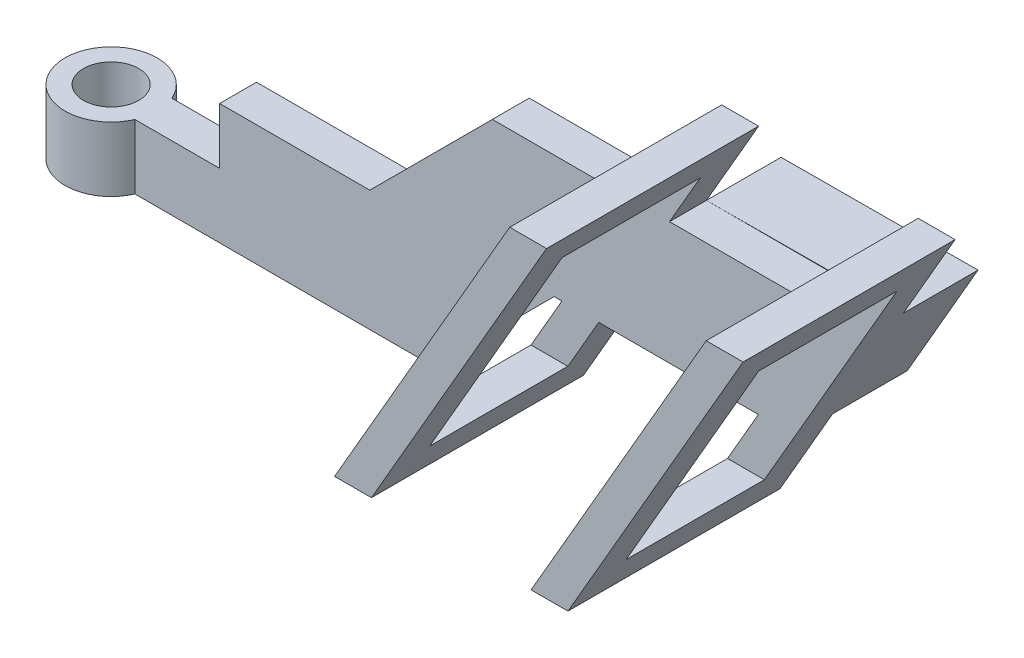
ISO-10303-21;
HEADER;
FILE_DESCRIPTION(('STEP AP214'),'2;1');
FILE_NAME('part.step','',(''),(''),'','','');
FILE_SCHEMA(('AUTOMOTIVE_DESIGN { 1 0 10303 214 1 1 1 1 }'));
ENDSEC;
DATA;
#1=APPLICATION_CONTEXT('core data for automotive mechanical design processes');
#2=APPLICATION_PROTOCOL_DEFINITION('international standard','automotive_design',2000,#1);
#3=PRODUCT_CONTEXT('',#1,'mechanical');
#4=PRODUCT('Part','Part','',(#3));
#5=PRODUCT_RELATED_PRODUCT_CATEGORY('part','',(#4));
#6=PRODUCT_DEFINITION_FORMATION('','',#4);
#7=PRODUCT_DEFINITION_CONTEXT('part definition',#1,'design');
#8=PRODUCT_DEFINITION('design','',#6,#7);
#9=PRODUCT_DEFINITION_SHAPE('','',#8);
#10=(LENGTH_UNIT() NAMED_UNIT(*) SI_UNIT(.MILLI.,.METRE.));
#11=(NAMED_UNIT(*) PLANE_ANGLE_UNIT() SI_UNIT($,.RADIAN.));
#12=(NAMED_UNIT(*) SI_UNIT($,.STERADIAN.) SOLID_ANGLE_UNIT());
#13=UNCERTAINTY_MEASURE_WITH_UNIT(LENGTH_MEASURE(1.E-05),#10,'distance_accuracy_value','');
#14=(GEOMETRIC_REPRESENTATION_CONTEXT(3) GLOBAL_UNCERTAINTY_ASSIGNED_CONTEXT((#13)) GLOBAL_UNIT_ASSIGNED_CONTEXT((#10,
#11,#12)) REPRESENTATION_CONTEXT('',''));
#15=CARTESIAN_POINT('',(0.,0.,0.));
#16=DIRECTION('',(0.,0.,1.));
#17=DIRECTION('',(1.,0.,0.));
#18=AXIS2_PLACEMENT_3D('',#15,#16,#17);
#19=CARTESIAN_POINT('',(34.5825756949558,0.,-2.));
#20=DIRECTION('',(0.,0.,-1.));
#21=DIRECTION('',(-1.,0.,0.));
#22=AXIS2_PLACEMENT_3D('',#19,#20,#21);
#23=PLANE('',#22);
#24=DIRECTION('',(1.,0.,0.));
#25=VECTOR('',#24,1.);
#26=CARTESIAN_POINT('',(50.0649607214572,13.1,-2.));
#27=LINE('',#26,#25);
#28=CARTESIAN_POINT('',(54.9050733556575,13.1,-2.00000000000001));
#29=VERTEX_POINT('',#28);
#30=CARTESIAN_POINT('',(72.2255814313463,13.1,-2.));
#31=VERTEX_POINT('',#30);
#32=EDGE_CURVE('E413',#29,#31,#27,.T.);
#33=ORIENTED_EDGE('',*,*,#32,.F.);
#34=DIRECTION('',(-0.999992305909303,-0.00392276970968819,0.));
#35=VECTOR('',#34,1.);
#36=CARTESIAN_POINT('',(54.9050733556575,13.1,-2.00000000000001));
#37=LINE('',#36,#35);
#38=CARTESIAN_POINT('',(76.2739783593554,13.1838259382421,-2.00000000000001));
#39=VERTEX_POINT('',#38);
#40=EDGE_CURVE('E276',#39,#29,#37,.T.);
#41=ORIENTED_EDGE('',*,*,#40,.F.);
#42=DIRECTION('',(0.5,0.866025403784439,0.));
#43=VECTOR('',#42,1.);
#44=CARTESIAN_POINT('',(76.2255814313462,13.1,-2.));
#45=LINE('',#44,#43);
#46=CARTESIAN_POINT('',(70.5649607214573,3.29551732809569,-2.));
#47=VERTEX_POINT('',#46);
#48=EDGE_CURVE('E418',#47,#39,#45,.T.);
#49=ORIENTED_EDGE('',*,*,#48,.F.);
#50=DIRECTION('',(1.,0.,0.));
#51=VECTOR('',#50,1.);
#52=CARTESIAN_POINT('',(66.5649607214573,3.29551732809569,-2.));
#53=LINE('',#52,#51);
#54=CARTESIAN_POINT('',(66.5649607214573,3.29551732809569,-2.));
#55=VERTEX_POINT('',#54);
#56=EDGE_CURVE('E351',#55,#47,#53,.T.);
#57=ORIENTED_EDGE('',*,*,#56,.F.);
#58=DIRECTION('',(-0.5,-0.866025403784439,0.));
#59=VECTOR('',#58,1.);
#60=CARTESIAN_POINT('',(85.5649607214573,36.2044826719044,-2.));
#61=LINE('',#60,#59);
#62=EDGE_CURVE('E353',#31,#55,#61,.T.);
#63=ORIENTED_EDGE('',*,*,#62,.F.);
#64=EDGE_LOOP('',(#33,#41,#49,#57,#63));
#65=FACE_BOUND('',#64,.T.);
#66=ADVANCED_FACE('F34',(#65),#23,.T.);
#67=DIRECTION('',(0.5,0.866025403784438,0.));
#68=VECTOR('',#67,1.);
#69=CARTESIAN_POINT('',(68.2444526457685,36.2044826719044,-2.));
#70=LINE('',#69,#68);
#71=CARTESIAN_POINT('',(62.5838319358795,26.4,-2.00000000000001));
#72=VERTEX_POINT('',#71);
#73=CARTESIAN_POINT('',(68.2444526457685,36.2044826719044,-2.));
#74=VERTEX_POINT('',#73);
#75=EDGE_CURVE('E379',#72,#74,#70,.T.);
#76=ORIENTED_EDGE('',*,*,#75,.F.);
#77=DIRECTION('',(0.5,0.866025403784438,0.));
#78=VECTOR('',#77,1.);
#79=CARTESIAN_POINT('',(54.9050733556575,13.1,-2.00000000000001));
#80=LINE('',#79,#78);
#81=EDGE_CURVE('E669',#29,#72,#80,.T.);
#82=ORIENTED_EDGE('',*,*,#81,.F.);
#83=CARTESIAN_POINT('',(49.2444526457685,3.2955173280957,-2.));
#84=VERTEX_POINT('',#83);
#85=EDGE_CURVE('E380',#84,#29,#70,.T.);
#86=ORIENTED_EDGE('',*,*,#85,.F.);
#87=DIRECTION('',(1.,0.,0.));
#88=VECTOR('',#87,1.);
#89=CARTESIAN_POINT('',(45.2444526457685,3.2955173280957,-2.));
#90=LINE('',#89,#88);
#91=CARTESIAN_POINT('',(45.2444526457685,3.2955173280957,-2.));
#92=VERTEX_POINT('',#91);
#93=EDGE_CURVE('E375',#92,#84,#90,.T.);
#94=ORIENTED_EDGE('',*,*,#93,.F.);
#95=DIRECTION('',(-0.5,-0.866025403784438,0.));
#96=VECTOR('',#95,1.);
#97=CARTESIAN_POINT('',(64.2444526457685,36.2044826719044,-2.));
#98=LINE('',#97,#96);
#99=CARTESIAN_POINT('',(50.9050733556575,13.1,-2.));
#100=VERTEX_POINT('',#99);
#101=EDGE_CURVE('E376',#100,#92,#98,.T.);
#102=ORIENTED_EDGE('',*,*,#101,.F.);
#103=CARTESIAN_POINT('',(50.0649607214572,13.1,-2.));
#104=VERTEX_POINT('',#103);
#105=EDGE_CURVE('E414',#104,#100,#27,.T.);
#106=ORIENTED_EDGE('',*,*,#105,.F.);
#107=DIRECTION('',(0.707106781186548,0.707106781186547,0.));
#108=VECTOR('',#107,1.);
#109=CARTESIAN_POINT('',(36.9649607214572,0.,-2.));
#110=LINE('',#109,#108);
#111=CARTESIAN_POINT('',(36.9649607214572,0.,-2.));
#112=VERTEX_POINT('',#111);
#113=EDGE_CURVE('E409',#112,#104,#110,.T.);
#114=ORIENTED_EDGE('',*,*,#113,.F.);
#115=DIRECTION('',(-1.,0.,0.));
#116=VECTOR('',#115,1.);
#117=CARTESIAN_POINT('',(34.5825756949558,0.,-2.));
#118=LINE('',#117,#116);
#119=CARTESIAN_POINT('',(4.58257569495584,0.,-2.));
#120=VERTEX_POINT('',#119);
#121=EDGE_CURVE('E470',#112,#120,#118,.T.);
#122=ORIENTED_EDGE('',*,*,#121,.T.);
#123=DIRECTION('',(0.,1.,0.));
#124=VECTOR('',#123,1.);
#125=CARTESIAN_POINT('',(4.58257569495584,0.,-2.));
#126=LINE('',#125,#124);
#127=CARTESIAN_POINT('',(4.58257569495584,7.,-2.));
#128=VERTEX_POINT('',#127);
#129=EDGE_CURVE('E476',#120,#128,#126,.T.);
#130=ORIENTED_EDGE('',*,*,#129,.T.);
#131=DIRECTION('',(-1.,0.,0.));
#132=VECTOR('',#131,1.);
#133=CARTESIAN_POINT('',(34.5825756949558,7.,-2.));
#134=LINE('',#133,#132);
#135=CARTESIAN_POINT('',(13.7765647923562,7.,-2.));
#136=VERTEX_POINT('',#135);
#137=EDGE_CURVE('E471',#136,#128,#134,.T.);
#138=ORIENTED_EDGE('',*,*,#137,.F.);
#139=DIRECTION('',(0.,-1.,0.));
#140=VECTOR('',#139,1.);
#141=CARTESIAN_POINT('',(13.7765647923562,0.,-2.));
#142=LINE('',#141,#140);
#143=CARTESIAN_POINT('',(13.7765647923562,13.1,-2.));
#144=VERTEX_POINT('',#143);
#145=EDGE_CURVE('E448',#144,#136,#142,.T.);
#146=ORIENTED_EDGE('',*,*,#145,.F.);
#147=DIRECTION('',(-1.,0.,0.));
#148=VECTOR('',#147,1.);
#149=CARTESIAN_POINT('',(13.7765647923562,13.1,-2.));
#150=LINE('',#149,#148);
#151=CARTESIAN_POINT('',(30.0649607214572,13.1,-2.));
#152=VERTEX_POINT('',#151);
#153=EDGE_CURVE('E451',#152,#144,#150,.T.);
#154=ORIENTED_EDGE('',*,*,#153,.F.);
#155=DIRECTION('',(-0.707106781186548,-0.707106781186547,0.));
#156=VECTOR('',#155,1.);
#157=CARTESIAN_POINT('',(43.3649607214573,26.4,-2.));
#158=LINE('',#157,#156);
#159=CARTESIAN_POINT('',(43.3649607214573,26.4,-2.));
#160=VERTEX_POINT('',#159);
#161=EDGE_CURVE('E406',#160,#152,#158,.T.);
#162=ORIENTED_EDGE('',*,*,#161,.F.);
#163=DIRECTION('',(-1.,0.,0.));
#164=VECTOR('',#163,1.);
#165=CARTESIAN_POINT('',(80.0649607214572,26.4,-2.));
#166=LINE('',#165,#164);
#167=CARTESIAN_POINT('',(58.5838319358795,26.4,-2.));
#168=VERTEX_POINT('',#167);
#169=EDGE_CURVE('E421',#168,#160,#166,.T.);
#170=ORIENTED_EDGE('',*,*,#169,.F.);
#171=CARTESIAN_POINT('',(64.2444526457685,36.2044826719044,-2.));
#172=VERTEX_POINT('',#171);
#173=EDGE_CURVE('E373',#172,#168,#98,.T.);
#174=ORIENTED_EDGE('',*,*,#173,.F.);
#175=DIRECTION('',(-1.,0.,0.));
#176=VECTOR('',#175,1.);
#177=CARTESIAN_POINT('',(64.2444526457685,36.2044826719044,-2.));
#178=LINE('',#177,#176);
#179=EDGE_CURVE('E383',#74,#172,#178,.T.);
#180=ORIENTED_EDGE('',*,*,#179,.F.);
#181=EDGE_LOOP('',(#76,#82,#86,#94,#102,#106,#114,#122,#130,#138,#146,#154,#162,#170,#174,#180));
#182=FACE_BOUND('',#181,.T.);
#183=ADVANCED_FACE('F592',(#182),#23,.T.);
#184=CARTESIAN_POINT('',(83.9527369395774,26.4838259382421,-2.00000000000001));
#185=VERTEX_POINT('',#184);
#186=CARTESIAN_POINT('',(89.5649607214573,36.2044826719044,-2.));
#187=VERTEX_POINT('',#186);
#188=EDGE_CURVE('E417',#185,#187,#45,.T.);
#189=ORIENTED_EDGE('',*,*,#188,.F.);
#190=DIRECTION('',(0.999992305909303,0.00392276970968795,0.));
#191=VECTOR('',#190,1.);
#192=CARTESIAN_POINT('',(62.5838319358795,26.4,-2.00000000000001));
#193=LINE('',#192,#191);
#194=CARTESIAN_POINT('',(79.943657056896,26.4680991201111,-2.00000000000001));
#195=VERTEX_POINT('',#194);
#196=EDGE_CURVE('E577',#195,#185,#193,.T.);
#197=ORIENTED_EDGE('',*,*,#196,.F.);
#198=CARTESIAN_POINT('',(85.5649607214573,36.2044826719044,-2.));
#199=VERTEX_POINT('',#198);
#200=EDGE_CURVE('E348',#199,#195,#61,.T.);
#201=ORIENTED_EDGE('',*,*,#200,.F.);
#202=DIRECTION('',(-1.,0.,0.));
#203=VECTOR('',#202,1.);
#204=CARTESIAN_POINT('',(85.5649607214573,36.2044826719044,-2.));
#205=LINE('',#204,#203);
#206=EDGE_CURVE('E356',#187,#199,#205,.T.);
#207=ORIENTED_EDGE('',*,*,#206,.F.);
#208=EDGE_LOOP('',(#189,#197,#201,#207));
#209=FACE_BOUND('',#208,.T.);
#210=ADVANCED_FACE('F576',(#209),#23,.T.);
#211=CARTESIAN_POINT('',(83.2555596446988,32.2044826719044,21.));
#212=DIRECTION('',(0.,1.,0.));
#213=DIRECTION('',(0.,0.,1.));
#214=AXIS2_PLACEMENT_3D('',#211,#212,#213);
#215=PLANE('',#214);
#216=DIRECTION('',(1.,0.,0.));
#217=VECTOR('',#216,1.);
#218=CARTESIAN_POINT('',(83.2555596446988,32.2044826719044,17.));
#219=LINE('',#218,#217);
#220=CARTESIAN_POINT('',(83.2555596446988,32.2044826719044,17.));
#221=VERTEX_POINT('',#220);
#222=CARTESIAN_POINT('',(87.2555596446987,32.2044826719044,17.));
#223=VERTEX_POINT('',#222);
#224=EDGE_CURVE('E289',#221,#223,#219,.T.);
#225=ORIENTED_EDGE('',*,*,#224,.F.);
#226=DIRECTION('',(0.,0.,-1.));
#227=VECTOR('',#226,1.);
#228=CARTESIAN_POINT('',(83.2555596446988,32.2044826719044,21.));
#229=LINE('',#228,#227);
#230=CARTESIAN_POINT('',(83.2555596446988,32.2044826719044,2.));
#231=VERTEX_POINT('',#230);
#232=EDGE_CURVE('E329',#221,#231,#229,.T.);
#233=ORIENTED_EDGE('',*,*,#232,.T.);
#234=DIRECTION('',(1.,0.,0.));
#235=VECTOR('',#234,1.);
#236=CARTESIAN_POINT('',(83.2555596446988,32.2044826719044,2.));
#237=LINE('',#236,#235);
#238=CARTESIAN_POINT('',(87.2555596446987,32.2044826719044,2.));
#239=VERTEX_POINT('',#238);
#240=EDGE_CURVE('E315',#231,#239,#237,.T.);
#241=ORIENTED_EDGE('',*,*,#240,.T.);
#242=DIRECTION('',(0.,0.,-1.));
#243=VECTOR('',#242,1.);
#244=CARTESIAN_POINT('',(87.2555596446988,32.2044826719044,21.));
#245=LINE('',#244,#243);
#246=EDGE_CURVE('E325',#223,#239,#245,.T.);
#247=ORIENTED_EDGE('',*,*,#246,.F.);
#248=EDGE_LOOP('',(#225,#233,#241,#247));
#249=FACE_BOUND('',#248,.T.);
#250=ADVANCED_FACE('F538',(#249),#215,.F.);
#251=CARTESIAN_POINT('',(68.8743617982158,7.2955173280957,21.));
#252=DIRECTION('',(0.,-1.,0.));
#253=DIRECTION('',(0.,0.,-1.));
#254=AXIS2_PLACEMENT_3D('',#251,#252,#253);
#255=PLANE('',#254);
#256=DIRECTION('',(-1.,0.,0.));
#257=VECTOR('',#256,1.);
#258=CARTESIAN_POINT('',(68.8743617982158,7.2955173280957,17.));
#259=LINE('',#258,#257);
#260=CARTESIAN_POINT('',(72.8743617982158,7.2955173280957,17.));
#261=VERTEX_POINT('',#260);
#262=CARTESIAN_POINT('',(68.8743617982158,7.2955173280957,17.));
#263=VERTEX_POINT('',#262);
#264=EDGE_CURVE('E11',#261,#263,#259,.T.);
#265=ORIENTED_EDGE('',*,*,#264,.F.);
#266=DIRECTION('',(0.,0.,-1.));
#267=VECTOR('',#266,1.);
#268=CARTESIAN_POINT('',(72.8743617982158,7.2955173280957,21.));
#269=LINE('',#268,#267);
#270=CARTESIAN_POINT('',(72.8743617982158,7.2955173280957,2.));
#271=VERTEX_POINT('',#270);
#272=EDGE_CURVE('E313',#261,#271,#269,.T.);
#273=ORIENTED_EDGE('',*,*,#272,.T.);
#274=DIRECTION('',(-1.,0.,0.));
#275=VECTOR('',#274,1.);
#276=CARTESIAN_POINT('',(68.8743617982158,7.2955173280957,2.));
#277=LINE('',#276,#275);
#278=CARTESIAN_POINT('',(68.8743617982158,7.2955173280957,2.));
#279=VERTEX_POINT('',#278);
#280=EDGE_CURVE('E305',#271,#279,#277,.T.);
#281=ORIENTED_EDGE('',*,*,#280,.T.);
#282=DIRECTION('',(0.,0.,-1.));
#283=VECTOR('',#282,1.);
#284=CARTESIAN_POINT('',(68.8743617982158,7.2955173280957,21.));
#285=LINE('',#284,#283);
#286=EDGE_CURVE('E309',#263,#279,#285,.T.);
#287=ORIENTED_EDGE('',*,*,#286,.F.);
#288=EDGE_LOOP('',(#265,#273,#281,#287));
#289=FACE_BOUND('',#288,.T.);
#290=ADVANCED_FACE('F528',(#289),#255,.F.);
#291=CARTESIAN_POINT('',(65.93505156901,32.2044826719044,21.));
#292=DIRECTION('',(0.,1.,0.));
#293=DIRECTION('',(0.,0.,1.));
#294=AXIS2_PLACEMENT_3D('',#291,#292,#293);
#295=PLANE('',#294);
#296=DIRECTION('',(1.,0.,0.));
#297=VECTOR('',#296,1.);
#298=CARTESIAN_POINT('',(65.93505156901,32.2044826719044,17.));
#299=LINE('',#298,#297);
#300=CARTESIAN_POINT('',(61.93505156901,32.2044826719044,17.));
#301=VERTEX_POINT('',#300);
#302=CARTESIAN_POINT('',(65.93505156901,32.2044826719044,17.));
#303=VERTEX_POINT('',#302);
#304=EDGE_CURVE('E296',#301,#303,#299,.T.);
#305=ORIENTED_EDGE('',*,*,#304,.F.);
#306=DIRECTION('',(0.,0.,-1.));
#307=VECTOR('',#306,1.);
#308=CARTESIAN_POINT('',(61.93505156901,32.2044826719044,21.));
#309=LINE('',#308,#307);
#310=CARTESIAN_POINT('',(61.93505156901,32.2044826719044,2.));
#311=VERTEX_POINT('',#310);
#312=EDGE_CURVE('E345',#301,#311,#309,.T.);
#313=ORIENTED_EDGE('',*,*,#312,.T.);
#314=DIRECTION('',(1.,0.,0.));
#315=VECTOR('',#314,1.);
#316=CARTESIAN_POINT('',(65.93505156901,32.2044826719044,2.));
#317=LINE('',#316,#315);
#318=CARTESIAN_POINT('',(65.93505156901,32.2044826719044,2.));
#319=VERTEX_POINT('',#318);
#320=EDGE_CURVE('E331',#311,#319,#317,.T.);
#321=ORIENTED_EDGE('',*,*,#320,.T.);
#322=DIRECTION('',(0.,0.,-1.));
#323=VECTOR('',#322,1.);
#324=CARTESIAN_POINT('',(65.93505156901,32.2044826719044,21.));
#325=LINE('',#324,#323);
#326=EDGE_CURVE('E341',#303,#319,#325,.T.);
#327=ORIENTED_EDGE('',*,*,#326,.F.);
#328=EDGE_LOOP('',(#305,#313,#321,#327));
#329=FACE_BOUND('',#328,.T.);
#330=ADVANCED_FACE('F608',(#329),#295,.F.);
#331=CARTESIAN_POINT('',(47.553853722527,7.2955173280957,21.));
#332=DIRECTION('',(0.,-1.,0.));
#333=DIRECTION('',(0.,0.,-1.));
#334=AXIS2_PLACEMENT_3D('',#331,#332,#333);
#335=PLANE('',#334);
#336=DIRECTION('',(-1.,0.,0.));
#337=VECTOR('',#336,1.);
#338=CARTESIAN_POINT('',(47.553853722527,7.2955173280957,17.));
#339=LINE('',#338,#337);
#340=CARTESIAN_POINT('',(51.553853722527,7.29551732809569,17.));
#341=VERTEX_POINT('',#340);
#342=CARTESIAN_POINT('',(47.553853722527,7.29551732809569,17.));
#343=VERTEX_POINT('',#342);
#344=EDGE_CURVE('E42',#341,#343,#339,.T.);
#345=ORIENTED_EDGE('',*,*,#344,.F.);
#346=DIRECTION('',(0.,0.,-1.));
#347=VECTOR('',#346,1.);
#348=CARTESIAN_POINT('',(51.553853722527,7.2955173280957,21.));
#349=LINE('',#348,#347);
#350=CARTESIAN_POINT('',(51.553853722527,7.2955173280957,2.));
#351=VERTEX_POINT('',#350);
#352=EDGE_CURVE('E49',#341,#351,#349,.T.);
#353=ORIENTED_EDGE('',*,*,#352,.T.);
#354=DIRECTION('',(-1.,0.,0.));
#355=VECTOR('',#354,1.);
#356=CARTESIAN_POINT('',(47.553853722527,7.2955173280957,2.));
#357=LINE('',#356,#355);
#358=CARTESIAN_POINT('',(47.553853722527,7.2955173280957,2.));
#359=VERTEX_POINT('',#358);
#360=EDGE_CURVE('E298',#351,#359,#357,.T.);
#361=ORIENTED_EDGE('',*,*,#360,.T.);
#362=DIRECTION('',(0.,0.,-1.));
#363=VECTOR('',#362,1.);
#364=CARTESIAN_POINT('',(47.553853722527,7.2955173280957,21.));
#365=LINE('',#364,#363);
#366=EDGE_CURVE('E57',#343,#359,#365,.T.);
#367=ORIENTED_EDGE('',*,*,#366,.F.);
#368=EDGE_LOOP('',(#345,#353,#361,#367));
#369=FACE_BOUND('',#368,.T.);
#370=ADVANCED_FACE('F506',(#369),#335,.F.);
#371=CARTESIAN_POINT('',(4.58257569495584,0.,2.));
#372=DIRECTION('',(0.,0.,1.));
#373=DIRECTION('',(1.,0.,0.));
#374=AXIS2_PLACEMENT_3D('',#371,#372,#373);
#375=PLANE('',#374);
#376=DIRECTION('',(-0.5,-0.866025403784438,0.));
#377=VECTOR('',#376,1.);
#378=CARTESIAN_POINT('',(64.2444526457685,36.2044826719044,2.));
#379=LINE('',#378,#377);
#380=CARTESIAN_POINT('',(50.9050733556575,13.1,2.));
#381=VERTEX_POINT('',#380);
#382=EDGE_CURVE('E372',#381,#359,#379,.T.);
#383=ORIENTED_EDGE('',*,*,#382,.T.);
#384=ORIENTED_EDGE('',*,*,#360,.F.);
#385=DIRECTION('',(0.5,0.866025403784438,0.));
#386=VECTOR('',#385,1.);
#387=CARTESIAN_POINT('',(68.2444526457685,36.2044826719044,2.));
#388=LINE('',#387,#386);
#389=CARTESIAN_POINT('',(54.9050733556575,13.1,2.));
#390=VERTEX_POINT('',#389);
#391=EDGE_CURVE('E390',#351,#390,#388,.T.);
#392=ORIENTED_EDGE('',*,*,#391,.T.);
#393=DIRECTION('',(1.,0.,0.));
#394=VECTOR('',#393,1.);
#395=CARTESIAN_POINT('',(50.0649607214572,13.1,2.));
#396=LINE('',#395,#394);
#397=CARTESIAN_POINT('',(72.2255814313463,13.1,2.));
#398=VERTEX_POINT('',#397);
#399=EDGE_CURVE('E431',#390,#398,#396,.T.);
#400=ORIENTED_EDGE('',*,*,#399,.T.);
#401=DIRECTION('',(-0.5,-0.866025403784439,0.));
#402=VECTOR('',#401,1.);
#403=CARTESIAN_POINT('',(85.5649607214573,36.2044826719044,2.));
#404=LINE('',#403,#402);
#405=EDGE_CURVE('E347',#398,#279,#404,.T.);
#406=ORIENTED_EDGE('',*,*,#405,.T.);
#407=ORIENTED_EDGE('',*,*,#280,.F.);
#408=DIRECTION('',(0.5,0.866025403784439,0.));
#409=VECTOR('',#408,1.);
#410=CARTESIAN_POINT('',(76.2255814313462,13.1,2.));
#411=LINE('',#410,#409);
#412=EDGE_CURVE('E435',#271,#239,#411,.T.);
#413=ORIENTED_EDGE('',*,*,#412,.T.);
#414=ORIENTED_EDGE('',*,*,#240,.F.);
#415=CARTESIAN_POINT('',(79.9043400115683,26.4,2.));
#416=VERTEX_POINT('',#415);
#417=EDGE_CURVE('E360',#231,#416,#404,.T.);
#418=ORIENTED_EDGE('',*,*,#417,.T.);
#419=DIRECTION('',(-1.,0.,0.));
#420=VECTOR('',#419,1.);
#421=CARTESIAN_POINT('',(80.0649607214572,26.4,2.));
#422=LINE('',#421,#420);
#423=CARTESIAN_POINT('',(62.5838319358795,26.4,2.));
#424=VERTEX_POINT('',#423);
#425=EDGE_CURVE('E410',#416,#424,#422,.T.);
#426=ORIENTED_EDGE('',*,*,#425,.T.);
#427=EDGE_CURVE('E389',#424,#319,#388,.T.);
#428=ORIENTED_EDGE('',*,*,#427,.T.);
#429=ORIENTED_EDGE('',*,*,#320,.F.);
#430=CARTESIAN_POINT('',(58.5838319358795,26.4,2.));
#431=VERTEX_POINT('',#430);
#432=EDGE_CURVE('E387',#311,#431,#379,.T.);
#433=ORIENTED_EDGE('',*,*,#432,.T.);
#434=CARTESIAN_POINT('',(43.3649607214573,26.4,2.));
#435=VERTEX_POINT('',#434);
#436=EDGE_CURVE('E438',#431,#435,#422,.T.);
#437=ORIENTED_EDGE('',*,*,#436,.T.);
#438=DIRECTION('',(-0.707106781186548,-0.707106781186547,0.));
#439=VECTOR('',#438,1.);
#440=CARTESIAN_POINT('',(43.3649607214573,26.4,2.));
#441=LINE('',#440,#439);
#442=CARTESIAN_POINT('',(30.0649607214572,13.1,2.));
#443=VERTEX_POINT('',#442);
#444=EDGE_CURVE('E405',#435,#443,#441,.T.);
#445=ORIENTED_EDGE('',*,*,#444,.T.);
#446=DIRECTION('',(-1.,0.,0.));
#447=VECTOR('',#446,1.);
#448=CARTESIAN_POINT('',(13.7765647923562,13.1,2.));
#449=LINE('',#448,#447);
#450=CARTESIAN_POINT('',(13.7765647923562,13.1,2.));
#451=VERTEX_POINT('',#450);
#452=EDGE_CURVE('E452',#443,#451,#449,.T.);
#453=ORIENTED_EDGE('',*,*,#452,.T.);
#454=DIRECTION('',(0.,-1.,0.));
#455=VECTOR('',#454,1.);
#456=CARTESIAN_POINT('',(13.7765647923562,0.,2.));
#457=LINE('',#456,#455);
#458=CARTESIAN_POINT('',(13.7765647923562,7.,2.));
#459=VERTEX_POINT('',#458);
#460=EDGE_CURVE('E443',#451,#459,#457,.T.);
#461=ORIENTED_EDGE('',*,*,#460,.T.);
#462=DIRECTION('',(1.,0.,0.));
#463=VECTOR('',#462,1.);
#464=CARTESIAN_POINT('',(4.58257569495584,7.,2.));
#465=LINE('',#464,#463);
#466=CARTESIAN_POINT('',(4.58257569495584,7.,2.));
#467=VERTEX_POINT('',#466);
#468=EDGE_CURVE('E467',#467,#459,#465,.T.);
#469=ORIENTED_EDGE('',*,*,#468,.F.);
#470=DIRECTION('',(0.,1.,0.));
#471=VECTOR('',#470,1.);
#472=CARTESIAN_POINT('',(4.58257569495584,0.,2.));
#473=LINE('',#472,#471);
#474=CARTESIAN_POINT('',(4.58257569495584,0.,2.));
#475=VERTEX_POINT('',#474);
#476=EDGE_CURVE('E473',#475,#467,#473,.T.);
#477=ORIENTED_EDGE('',*,*,#476,.F.);
#478=DIRECTION('',(1.,0.,0.));
#479=VECTOR('',#478,1.);
#480=CARTESIAN_POINT('',(4.58257569495584,0.,2.));
#481=LINE('',#480,#479);
#482=CARTESIAN_POINT('',(36.9649607214572,0.,2.));
#483=VERTEX_POINT('',#482);
#484=EDGE_CURVE('E468',#475,#483,#481,.T.);
#485=ORIENTED_EDGE('',*,*,#484,.T.);
#486=DIRECTION('',(0.707106781186548,0.707106781186547,0.));
#487=VECTOR('',#486,1.);
#488=CARTESIAN_POINT('',(36.9649607214572,0.,2.));
#489=LINE('',#488,#487);
#490=CARTESIAN_POINT('',(50.0649607214572,13.1,2.));
#491=VERTEX_POINT('',#490);
#492=EDGE_CURVE('E428',#483,#491,#489,.T.);
#493=ORIENTED_EDGE('',*,*,#492,.T.);
#494=EDGE_CURVE('E432',#491,#381,#396,.T.);
#495=ORIENTED_EDGE('',*,*,#494,.T.);
#496=EDGE_LOOP('',(#383,#384,#392,#400,#406,#407,#413,#414,#418,#426,#428,#429,#433,#437,#445,
#453,#461,#469,#477,#485,#493,#495));
#497=FACE_BOUND('',#496,.T.);
#498=ADVANCED_FACE('F509',(#497),#375,.T.);
#499=CARTESIAN_POINT('',(80.0649607214572,26.4,-2.));
#500=DIRECTION('',(0.,1.,0.));
#501=DIRECTION('',(-1.,0.,0.));
#502=AXIS2_PLACEMENT_3D('',#499,#500,#501);
#503=PLANE('',#502);
#504=DIRECTION('',(0.,0.,1.));
#505=VECTOR('',#504,1.);
#506=CARTESIAN_POINT('',(58.5838319358795,26.4,-2.));
#507=LINE('',#506,#505);
#508=EDGE_CURVE('E402',#168,#431,#507,.T.);
#509=ORIENTED_EDGE('',*,*,#508,.F.);
#510=ORIENTED_EDGE('',*,*,#169,.T.);
#511=DIRECTION('',(0.,0.,1.));
#512=VECTOR('',#511,1.);
#513=CARTESIAN_POINT('',(43.3649607214573,26.4,-2.));
#514=LINE('',#513,#512);
#515=EDGE_CURVE('E440',#160,#435,#514,.T.);
#516=ORIENTED_EDGE('',*,*,#515,.T.);
#517=ORIENTED_EDGE('',*,*,#436,.F.);
#518=EDGE_LOOP('',(#509,#510,#516,#517));
#519=FACE_BOUND('',#518,.T.);
#520=ADVANCED_FACE('F622',(#519),#503,.T.);
#521=CARTESIAN_POINT('',(50.0649607214572,13.1,-2.));
#522=DIRECTION('',(0.,-1.,0.));
#523=DIRECTION('',(1.,0.,0.));
#524=AXIS2_PLACEMENT_3D('',#521,#522,#523);
#525=PLANE('',#524);
#526=DIRECTION('',(0.,0.,-1.));
#527=VECTOR('',#526,1.);
#528=CARTESIAN_POINT('',(50.9050733556575,13.1,-2.));
#529=LINE('',#528,#527);
#530=EDGE_CURVE('E496',#381,#100,#529,.T.);
#531=ORIENTED_EDGE('',*,*,#530,.F.);
#532=ORIENTED_EDGE('',*,*,#494,.F.);
#533=DIRECTION('',(0.,0.,1.));
#534=VECTOR('',#533,1.);
#535=CARTESIAN_POINT('',(50.0649607214572,13.1,-2.));
#536=LINE('',#535,#534);
#537=EDGE_CURVE('E444',#104,#491,#536,.T.);
#538=ORIENTED_EDGE('',*,*,#537,.F.);
#539=ORIENTED_EDGE('',*,*,#105,.T.);
#540=EDGE_LOOP('',(#531,#532,#538,#539));
#541=FACE_BOUND('',#540,.T.);
#542=ADVANCED_FACE('F656',(#541),#525,.T.);
#543=CARTESIAN_POINT('',(0.,7.,0.));
#544=DIRECTION('',(0.,1.,0.));
#545=DIRECTION('',(0.,0.,1.));
#546=AXIS2_PLACEMENT_3D('',#543,#544,#545);
#547=PLANE('',#546);
#548=DIRECTION('',(0.,0.,1.));
#549=VECTOR('',#548,1.);
#550=CARTESIAN_POINT('',(13.7765647923562,7.,0.));
#551=LINE('',#550,#549);
#552=EDGE_CURVE('E462',#136,#459,#551,.T.);
#553=ORIENTED_EDGE('',*,*,#552,.F.);
#554=ORIENTED_EDGE('',*,*,#137,.T.);
#555=CARTESIAN_POINT('',(0.,7.,0.));
#556=DIRECTION('',(0.,1.,0.));
#557=DIRECTION('',(0.,0.,1.));
#558=AXIS2_PLACEMENT_3D('',#555,#556,#557);
#559=CIRCLE('',#558,5.);
#560=EDGE_CURVE('E488',#128,#467,#559,.T.);
#561=ORIENTED_EDGE('',*,*,#560,.T.);
#562=ORIENTED_EDGE('',*,*,#468,.T.);
#563=EDGE_LOOP('',(#553,#554,#561,#562));
#564=FACE_BOUND('',#563,.T.);
#565=CARTESIAN_POINT('',(0.,7.,0.));
#566=DIRECTION('',(0.,1.,0.));
#567=DIRECTION('',(0.,0.,1.));
#568=AXIS2_PLACEMENT_3D('',#565,#566,#567);
#569=CIRCLE('',#568,3.);
#570=CARTESIAN_POINT('',(0.,7.,3.));
#571=VERTEX_POINT('',#570);
#572=EDGE_CURVE('E482',#571,#571,#569,.T.);
#573=ORIENTED_EDGE('',*,*,#572,.F.);
#574=EDGE_LOOP('',(#573));
#575=FACE_BOUND('',#574,.T.);
#576=ADVANCED_FACE('F642',(#564,#575),#547,.T.);
#577=CARTESIAN_POINT('',(0.,0.,0.));
#578=DIRECTION('',(0.,1.,0.));
#579=DIRECTION('',(0.,0.,1.));
#580=AXIS2_PLACEMENT_3D('',#577,#578,#579);
#581=PLANE('',#580);
#582=ORIENTED_EDGE('',*,*,#121,.F.);
#583=DIRECTION('',(0.,0.,1.));
#584=VECTOR('',#583,1.);
#585=CARTESIAN_POINT('',(36.9649607214572,0.,-2.));
#586=LINE('',#585,#584);
#587=EDGE_CURVE('E425',#112,#483,#586,.T.);
#588=ORIENTED_EDGE('',*,*,#587,.T.);
#589=ORIENTED_EDGE('',*,*,#484,.F.);
#590=CARTESIAN_POINT('',(0.,0.,0.));
#591=DIRECTION('',(0.,1.,0.));
#592=DIRECTION('',(0.,0.,1.));
#593=AXIS2_PLACEMENT_3D('',#590,#591,#592);
#594=CIRCLE('',#593,5.);
#595=EDGE_CURVE('E485',#120,#475,#594,.T.);
#596=ORIENTED_EDGE('',*,*,#595,.F.);
#597=EDGE_LOOP('',(#582,#588,#589,#596));
#598=FACE_BOUND('',#597,.T.);
#599=CARTESIAN_POINT('',(0.,0.,0.));
#600=DIRECTION('',(0.,1.,0.));
#601=DIRECTION('',(0.,0.,1.));
#602=AXIS2_PLACEMENT_3D('',#599,#600,#601);
#603=CIRCLE('',#602,3.);
#604=CARTESIAN_POINT('',(0.,0.,3.));
#605=VERTEX_POINT('',#604);
#606=EDGE_CURVE('E479',#605,#605,#603,.T.);
#607=ORIENTED_EDGE('',*,*,#606,.T.);
#608=EDGE_LOOP('',(#607));
#609=FACE_BOUND('',#608,.T.);
#610=ADVANCED_FACE('F646',(#598,#609),#581,.F.);
#611=CARTESIAN_POINT('',(0.,7.,0.));
#612=DIRECTION('',(0.,-1.,0.));
#613=DIRECTION('',(0.,0.,-1.));
#614=AXIS2_PLACEMENT_3D('',#611,#612,#613);
#615=CYLINDRICAL_SURFACE('',#614,5.);
#616=ORIENTED_EDGE('',*,*,#560,.F.);
#617=ORIENTED_EDGE('',*,*,#129,.F.);
#618=ORIENTED_EDGE('',*,*,#595,.T.);
#619=ORIENTED_EDGE('',*,*,#476,.T.);
#620=EDGE_LOOP('',(#616,#617,#618,#619));
#621=FACE_BOUND('',#620,.T.);
#622=ADVANCED_FACE('F36',(#621),#615,.T.);
#623=CARTESIAN_POINT('',(0.,7.,0.));
#624=DIRECTION('',(0.,-1.,0.));
#625=DIRECTION('',(0.,0.,-1.));
#626=AXIS2_PLACEMENT_3D('',#623,#624,#625);
#627=CYLINDRICAL_SURFACE('',#626,3.);
#628=ORIENTED_EDGE('',*,*,#572,.T.);
#629=EDGE_LOOP('',(#628));
#630=FACE_BOUND('',#629,.T.);
#631=ORIENTED_EDGE('',*,*,#606,.F.);
#632=EDGE_LOOP('',(#631));
#633=FACE_BOUND('',#632,.T.);
#634=ADVANCED_FACE('F852',(#630,#633),#627,.F.);
#635=CARTESIAN_POINT('',(13.7765647923562,0.,-2.));
#636=DIRECTION('',(-1.,0.,0.));
#637=DIRECTION('',(0.,0.,1.));
#638=AXIS2_PLACEMENT_3D('',#635,#636,#637);
#639=PLANE('',#638);
#640=ORIENTED_EDGE('',*,*,#145,.T.);
#641=ORIENTED_EDGE('',*,*,#552,.T.);
#642=ORIENTED_EDGE('',*,*,#460,.F.);
#643=DIRECTION('',(0.,0.,1.));
#644=VECTOR('',#643,1.);
#645=CARTESIAN_POINT('',(13.7765647923562,13.1,-2.));
#646=LINE('',#645,#644);
#647=EDGE_CURVE('E460',#144,#451,#646,.T.);
#648=ORIENTED_EDGE('',*,*,#647,.F.);
#649=EDGE_LOOP('',(#640,#641,#642,#648));
#650=FACE_BOUND('',#649,.T.);
#651=ADVANCED_FACE('F634',(#650),#639,.T.);
#652=CARTESIAN_POINT('',(13.7765647923562,13.1,-2.));
#653=DIRECTION('',(0.,1.,0.));
#654=DIRECTION('',(0.,0.,1.));
#655=AXIS2_PLACEMENT_3D('',#652,#653,#654);
#656=PLANE('',#655);
#657=ORIENTED_EDGE('',*,*,#452,.F.);
#658=DIRECTION('',(0.,0.,1.));
#659=VECTOR('',#658,1.);
#660=CARTESIAN_POINT('',(30.0649607214572,13.1,-2.));
#661=LINE('',#660,#659);
#662=EDGE_CURVE('E455',#152,#443,#661,.T.);
#663=ORIENTED_EDGE('',*,*,#662,.F.);
#664=ORIENTED_EDGE('',*,*,#153,.T.);
#665=ORIENTED_EDGE('',*,*,#647,.T.);
#666=EDGE_LOOP('',(#657,#663,#664,#665));
#667=FACE_BOUND('',#666,.T.);
#668=ADVANCED_FACE('F630',(#667),#656,.T.);
#669=CARTESIAN_POINT('',(43.3649607214573,26.4,-2.));
#670=DIRECTION('',(-0.707106781186547,0.707106781186548,0.));
#671=DIRECTION('',(-0.707106781186548,-0.707106781186547,0.));
#672=AXIS2_PLACEMENT_3D('',#669,#670,#671);
#673=PLANE('',#672);
#674=ORIENTED_EDGE('',*,*,#444,.F.);
#675=ORIENTED_EDGE('',*,*,#515,.F.);
#676=ORIENTED_EDGE('',*,*,#161,.T.);
#677=ORIENTED_EDGE('',*,*,#662,.T.);
#678=EDGE_LOOP('',(#674,#675,#676,#677));
#679=FACE_BOUND('',#678,.T.);
#680=ADVANCED_FACE('F626',(#679),#673,.T.);
#681=DIRECTION('',(0.,0.,1.));
#682=VECTOR('',#681,1.);
#683=CARTESIAN_POINT('',(79.9043400115683,26.4,-2.));
#684=LINE('',#683,#682);
#685=CARTESIAN_POINT('',(79.9043400115683,26.4,-2.));
#686=VERTEX_POINT('',#685);
#687=EDGE_CURVE('E364',#686,#416,#684,.T.);
#688=ORIENTED_EDGE('',*,*,#687,.F.);
#689=EDGE_CURVE('E422',#686,#72,#166,.T.);
#690=ORIENTED_EDGE('',*,*,#689,.T.);
#691=DIRECTION('',(0.,0.,-1.));
#692=VECTOR('',#691,1.);
#693=CARTESIAN_POINT('',(62.5838319358795,26.4,-2.));
#694=LINE('',#693,#692);
#695=EDGE_CURVE('E394',#424,#72,#694,.T.);
#696=ORIENTED_EDGE('',*,*,#695,.F.);
#697=ORIENTED_EDGE('',*,*,#425,.F.);
#698=EDGE_LOOP('',(#688,#690,#696,#697));
#699=FACE_BOUND('',#698,.T.);
#700=ADVANCED_FACE('F552',(#699),#503,.T.);
#701=CARTESIAN_POINT('',(76.2255814313462,13.1,-2.));
#702=DIRECTION('',(0.866025403784439,-0.5,0.));
#703=DIRECTION('',(0.5,0.866025403784439,0.));
#704=AXIS2_PLACEMENT_3D('',#701,#702,#703);
#705=PLANE('',#704);
#706=DIRECTION('',(0.5,0.866025403784439,0.));
#707=VECTOR('',#706,1.);
#708=CARTESIAN_POINT('',(89.5649607214573,36.2044826719044,17.));
#709=LINE('',#708,#707);
#710=EDGE_CURVE('E281',#261,#223,#709,.T.);
#711=ORIENTED_EDGE('',*,*,#710,.T.);
#712=ORIENTED_EDGE('',*,*,#246,.T.);
#713=ORIENTED_EDGE('',*,*,#412,.F.);
#714=ORIENTED_EDGE('',*,*,#272,.F.);
#715=EDGE_LOOP('',(#711,#712,#713,#714));
#716=FACE_BOUND('',#715,.T.);
#717=DIRECTION('',(0.499999999999998,0.86602540378444,0.));
#718=VECTOR('',#717,1.);
#719=CARTESIAN_POINT('',(89.5649607214573,36.2044826719044,21.));
#720=LINE('',#719,#718);
#721=CARTESIAN_POINT('',(70.5649607214573,3.29551732809569,21.));
#722=VERTEX_POINT('',#721);
#723=CARTESIAN_POINT('',(89.5649607214573,36.2044826719044,21.));
#724=VERTEX_POINT('',#723);
#725=EDGE_CURVE('E319',#722,#724,#720,.T.);
#726=ORIENTED_EDGE('',*,*,#725,.F.);
#727=DIRECTION('',(0.,0.,1.));
#728=VECTOR('',#727,1.);
#729=CARTESIAN_POINT('',(70.5649607214573,3.29551732809569,-2.));
#730=LINE('',#729,#728);
#731=EDGE_CURVE('E367',#47,#722,#730,.T.);
#732=ORIENTED_EDGE('',*,*,#731,.F.);
#733=ORIENTED_EDGE('',*,*,#48,.T.);
#734=DIRECTION('',(0.,0.,1.));
#735=VECTOR('',#734,1.);
#736=CARTESIAN_POINT('',(76.2739783593554,13.1838259382421,-10.1));
#737=LINE('',#736,#735);
#738=CARTESIAN_POINT('',(76.2739783593554,13.1838259382421,-10.1));
#739=VERTEX_POINT('',#738);
#740=EDGE_CURVE('E675',#739,#39,#737,.T.);
#741=ORIENTED_EDGE('',*,*,#740,.F.);
#742=DIRECTION('',(-0.500000000000001,-0.866025403784438,0.));
#743=VECTOR('',#742,1.);
#744=CARTESIAN_POINT('',(76.2739783593554,13.1838259382421,-10.1));
#745=LINE('',#744,#743);
#746=CARTESIAN_POINT('',(83.9527369395774,26.4838259382421,-10.1));
#747=VERTEX_POINT('',#746);
#748=EDGE_CURVE('E269',#747,#739,#745,.T.);
#749=ORIENTED_EDGE('',*,*,#748,.F.);
#750=DIRECTION('',(0.,0.,1.));
#751=VECTOR('',#750,1.);
#752=CARTESIAN_POINT('',(83.9527369395774,26.4838259382421,-10.1));
#753=LINE('',#752,#751);
#754=EDGE_CURVE('E283',#747,#185,#753,.T.);
#755=ORIENTED_EDGE('',*,*,#754,.T.);
#756=ORIENTED_EDGE('',*,*,#188,.T.);
#757=DIRECTION('',(0.,0.,1.));
#758=VECTOR('',#757,1.);
#759=CARTESIAN_POINT('',(89.5649607214573,36.2044826719044,-2.));
#760=LINE('',#759,#758);
#761=EDGE_CURVE('E365',#187,#724,#760,.T.);
#762=ORIENTED_EDGE('',*,*,#761,.T.);
#763=EDGE_LOOP('',(#726,#732,#733,#741,#749,#755,#756,#762));
#764=FACE_BOUND('',#763,.T.);
#765=ADVANCED_FACE('F531',(#716,#764),#705,.T.);
#766=DIRECTION('',(0.,0.,-1.));
#767=VECTOR('',#766,1.);
#768=CARTESIAN_POINT('',(72.2255814313463,13.1,-2.));
#769=LINE('',#768,#767);
#770=EDGE_CURVE('E498',#398,#31,#769,.T.);
#771=ORIENTED_EDGE('',*,*,#770,.F.);
#772=ORIENTED_EDGE('',*,*,#399,.F.);
#773=DIRECTION('',(0.,0.,1.));
#774=VECTOR('',#773,1.);
#775=CARTESIAN_POINT('',(54.9050733556575,13.1,-2.));
#776=LINE('',#775,#774);
#777=EDGE_CURVE('E491',#29,#390,#776,.T.);
#778=ORIENTED_EDGE('',*,*,#777,.F.);
#779=ORIENTED_EDGE('',*,*,#32,.T.);
#780=EDGE_LOOP('',(#771,#772,#778,#779));
#781=FACE_BOUND('',#780,.T.);
#782=ADVANCED_FACE('F520',(#781),#525,.T.);
#783=CARTESIAN_POINT('',(36.9649607214572,0.,-2.));
#784=DIRECTION('',(0.707106781186547,-0.707106781186548,0.));
#785=DIRECTION('',(0.707106781186548,0.707106781186547,0.));
#786=AXIS2_PLACEMENT_3D('',#783,#784,#785);
#787=PLANE('',#786);
#788=ORIENTED_EDGE('',*,*,#492,.F.);
#789=ORIENTED_EDGE('',*,*,#587,.F.);
#790=ORIENTED_EDGE('',*,*,#113,.T.);
#791=ORIENTED_EDGE('',*,*,#537,.T.);
#792=EDGE_LOOP('',(#788,#789,#790,#791));
#793=FACE_BOUND('',#792,.T.);
#794=ADVANCED_FACE('F652',(#793),#787,.T.);
#795=CARTESIAN_POINT('',(45.2444526457685,3.2955173280957,-2.));
#796=DIRECTION('',(0.,-1.,0.));
#797=DIRECTION('',(1.,0.,0.));
#798=AXIS2_PLACEMENT_3D('',#795,#796,#797);
#799=PLANE('',#798);
#800=DIRECTION('',(1.,0.,0.));
#801=VECTOR('',#800,1.);
#802=CARTESIAN_POINT('',(45.2444526457685,3.2955173280957,21.));
#803=LINE('',#802,#801);
#804=CARTESIAN_POINT('',(45.2444526457685,3.2955173280957,21.));
#805=VERTEX_POINT('',#804);
#806=CARTESIAN_POINT('',(49.2444526457685,3.2955173280957,21.));
#807=VERTEX_POINT('',#806);
#808=EDGE_CURVE('E299',#805,#807,#803,.T.);
#809=ORIENTED_EDGE('',*,*,#808,.F.);
#810=DIRECTION('',(0.,0.,1.));
#811=VECTOR('',#810,1.);
#812=CARTESIAN_POINT('',(45.2444526457685,3.2955173280957,-2.));
#813=LINE('',#812,#811);
#814=EDGE_CURVE('E386',#92,#805,#813,.T.);
#815=ORIENTED_EDGE('',*,*,#814,.F.);
#816=ORIENTED_EDGE('',*,*,#93,.T.);
#817=DIRECTION('',(0.,0.,1.));
#818=VECTOR('',#817,1.);
#819=CARTESIAN_POINT('',(49.2444526457685,3.2955173280957,-2.));
#820=LINE('',#819,#818);
#821=EDGE_CURVE('E397',#84,#807,#820,.T.);
#822=ORIENTED_EDGE('',*,*,#821,.T.);
#823=EDGE_LOOP('',(#809,#815,#816,#822));
#824=FACE_BOUND('',#823,.T.);
#825=ADVANCED_FACE('F662',(#824),#799,.T.);
#826=CARTESIAN_POINT('',(64.2444526457685,36.2044826719044,-2.));
#827=DIRECTION('',(-0.866025403784438,0.5,0.));
#828=DIRECTION('',(-0.5,-0.866025403784438,0.));
#829=AXIS2_PLACEMENT_3D('',#826,#827,#828);
#830=PLANE('',#829);
#831=DIRECTION('',(-0.500000000000001,-0.866025403784438,0.));
#832=VECTOR('',#831,1.);
#833=CARTESIAN_POINT('',(64.2444526457685,36.2044826719044,21.));
#834=LINE('',#833,#832);
#835=CARTESIAN_POINT('',(64.2444526457685,36.2044826719044,21.));
#836=VERTEX_POINT('',#835);
#837=EDGE_CURVE('E338',#836,#805,#834,.T.);
#838=ORIENTED_EDGE('',*,*,#837,.F.);
#839=DIRECTION('',(0.,0.,1.));
#840=VECTOR('',#839,1.);
#841=CARTESIAN_POINT('',(64.2444526457685,36.2044826719044,-2.));
#842=LINE('',#841,#840);
#843=EDGE_CURVE('E392',#172,#836,#842,.T.);
#844=ORIENTED_EDGE('',*,*,#843,.F.);
#845=ORIENTED_EDGE('',*,*,#173,.T.);
#846=ORIENTED_EDGE('',*,*,#508,.T.);
#847=ORIENTED_EDGE('',*,*,#432,.F.);
#848=ORIENTED_EDGE('',*,*,#312,.F.);
#849=DIRECTION('',(-0.5,-0.866025403784438,0.));
#850=VECTOR('',#849,1.);
#851=CARTESIAN_POINT('',(64.2444526457685,36.2044826719044,17.));
#852=LINE('',#851,#850);
#853=EDGE_CURVE('E291',#301,#343,#852,.T.);
#854=ORIENTED_EDGE('',*,*,#853,.T.);
#855=ORIENTED_EDGE('',*,*,#366,.T.);
#856=ORIENTED_EDGE('',*,*,#382,.F.);
#857=ORIENTED_EDGE('',*,*,#530,.T.);
#858=ORIENTED_EDGE('',*,*,#101,.T.);
#859=ORIENTED_EDGE('',*,*,#814,.T.);
#860=EDGE_LOOP('',(#838,#844,#845,#846,#847,#848,#854,#855,#856,#857,#858,#859));
#861=FACE_BOUND('',#860,.T.);
#862=ADVANCED_FACE('F504',(#861),#830,.T.);
#863=CARTESIAN_POINT('',(68.2444526457685,36.2044826719044,-2.));
#864=DIRECTION('',(0.866025403784438,-0.5,0.));
#865=DIRECTION('',(0.5,0.866025403784438,0.));
#866=AXIS2_PLACEMENT_3D('',#863,#864,#865);
#867=PLANE('',#866);
#868=DIRECTION('',(0.5,0.866025403784438,0.));
#869=VECTOR('',#868,1.);
#870=CARTESIAN_POINT('',(68.2444526457685,36.2044826719044,17.));
#871=LINE('',#870,#869);
#872=EDGE_CURVE('E293',#341,#303,#871,.T.);
#873=ORIENTED_EDGE('',*,*,#872,.T.);
#874=ORIENTED_EDGE('',*,*,#326,.T.);
#875=ORIENTED_EDGE('',*,*,#427,.F.);
#876=ORIENTED_EDGE('',*,*,#695,.T.);
#877=ORIENTED_EDGE('',*,*,#75,.T.);
#878=DIRECTION('',(0.,0.,1.));
#879=VECTOR('',#878,1.);
#880=CARTESIAN_POINT('',(68.2444526457685,36.2044826719044,-2.));
#881=LINE('',#880,#879);
#882=CARTESIAN_POINT('',(68.2444526457685,36.2044826719044,21.));
#883=VERTEX_POINT('',#882);
#884=EDGE_CURVE('E395',#74,#883,#881,.T.);
#885=ORIENTED_EDGE('',*,*,#884,.T.);
#886=DIRECTION('',(0.5,0.866025403784439,0.));
#887=VECTOR('',#886,1.);
#888=CARTESIAN_POINT('',(68.2444526457685,36.2044826719044,21.));
#889=LINE('',#888,#887);
#890=EDGE_CURVE('E332',#807,#883,#889,.T.);
#891=ORIENTED_EDGE('',*,*,#890,.F.);
#892=ORIENTED_EDGE('',*,*,#821,.F.);
#893=ORIENTED_EDGE('',*,*,#85,.T.);
#894=ORIENTED_EDGE('',*,*,#777,.T.);
#895=ORIENTED_EDGE('',*,*,#391,.F.);
#896=ORIENTED_EDGE('',*,*,#352,.F.);
#897=EDGE_LOOP('',(#873,#874,#875,#876,#877,#885,#891,#892,#893,#894,#895,#896));
#898=FACE_BOUND('',#897,.T.);
#899=ADVANCED_FACE('F512',(#898),#867,.T.);
#900=CARTESIAN_POINT('',(64.2444526457685,36.2044826719044,-2.));
#901=DIRECTION('',(0.,1.,0.));
#902=DIRECTION('',(0.,0.,1.));
#903=AXIS2_PLACEMENT_3D('',#900,#901,#902);
#904=PLANE('',#903);
#905=DIRECTION('',(-1.,0.,0.));
#906=VECTOR('',#905,1.);
#907=CARTESIAN_POINT('',(68.2444526457685,36.2044826719044,21.));
#908=LINE('',#907,#906);
#909=EDGE_CURVE('E335',#883,#836,#908,.T.);
#910=ORIENTED_EDGE('',*,*,#909,.F.);
#911=ORIENTED_EDGE('',*,*,#884,.F.);
#912=ORIENTED_EDGE('',*,*,#179,.T.);
#913=ORIENTED_EDGE('',*,*,#843,.T.);
#914=EDGE_LOOP('',(#910,#911,#912,#913));
#915=FACE_BOUND('',#914,.T.);
#916=ADVANCED_FACE('F667',(#915),#904,.T.);
#917=CARTESIAN_POINT('',(66.5649607214573,3.29551732809569,-2.));
#918=DIRECTION('',(0.,-1.,0.));
#919=DIRECTION('',(1.,0.,0.));
#920=AXIS2_PLACEMENT_3D('',#917,#918,#919);
#921=PLANE('',#920);
#922=DIRECTION('',(1.,0.,0.));
#923=VECTOR('',#922,1.);
#924=CARTESIAN_POINT('',(66.5649607214573,3.29551732809569,21.));
#925=LINE('',#924,#923);
#926=CARTESIAN_POINT('',(66.5649607214573,3.29551732809569,21.));
#927=VERTEX_POINT('',#926);
#928=EDGE_CURVE('E306',#927,#722,#925,.T.);
#929=ORIENTED_EDGE('',*,*,#928,.F.);
#930=DIRECTION('',(0.,0.,1.));
#931=VECTOR('',#930,1.);
#932=CARTESIAN_POINT('',(66.5649607214573,3.29551732809569,-2.));
#933=LINE('',#932,#931);
#934=EDGE_CURVE('E359',#55,#927,#933,.T.);
#935=ORIENTED_EDGE('',*,*,#934,.F.);
#936=ORIENTED_EDGE('',*,*,#56,.T.);
#937=ORIENTED_EDGE('',*,*,#731,.T.);
#938=EDGE_LOOP('',(#929,#935,#936,#937));
#939=FACE_BOUND('',#938,.T.);
#940=ADVANCED_FACE('F564',(#939),#921,.T.);
#941=CARTESIAN_POINT('',(85.5649607214573,36.2044826719044,-2.));
#942=DIRECTION('',(-0.866025403784439,0.5,0.));
#943=DIRECTION('',(-0.5,-0.866025403784439,0.));
#944=AXIS2_PLACEMENT_3D('',#941,#942,#943);
#945=PLANE('',#944);
#946=DIRECTION('',(-0.5,-0.866025403784439,0.));
#947=VECTOR('',#946,1.);
#948=CARTESIAN_POINT('',(85.5649607214573,36.2044826719044,21.));
#949=LINE('',#948,#947);
#950=CARTESIAN_POINT('',(85.5649607214573,36.2044826719044,21.));
#951=VERTEX_POINT('',#950);
#952=EDGE_CURVE('E316',#951,#927,#949,.T.);
#953=ORIENTED_EDGE('',*,*,#952,.F.);
#954=DIRECTION('',(0.,0.,1.));
#955=VECTOR('',#954,1.);
#956=CARTESIAN_POINT('',(85.5649607214573,36.2044826719044,-2.));
#957=LINE('',#956,#955);
#958=EDGE_CURVE('E362',#199,#951,#957,.T.);
#959=ORIENTED_EDGE('',*,*,#958,.F.);
#960=ORIENTED_EDGE('',*,*,#200,.T.);
#961=EDGE_CURVE('E352',#195,#686,#61,.T.);
#962=ORIENTED_EDGE('',*,*,#961,.T.);
#963=ORIENTED_EDGE('',*,*,#687,.T.);
#964=ORIENTED_EDGE('',*,*,#417,.F.);
#965=ORIENTED_EDGE('',*,*,#232,.F.);
#966=DIRECTION('',(-0.5,-0.866025403784439,0.));
#967=VECTOR('',#966,1.);
#968=CARTESIAN_POINT('',(85.5649607214573,36.2044826719044,17.));
#969=LINE('',#968,#967);
#970=EDGE_CURVE('E278',#221,#263,#969,.T.);
#971=ORIENTED_EDGE('',*,*,#970,.T.);
#972=ORIENTED_EDGE('',*,*,#286,.T.);
#973=ORIENTED_EDGE('',*,*,#405,.F.);
#974=ORIENTED_EDGE('',*,*,#770,.T.);
#975=ORIENTED_EDGE('',*,*,#62,.T.);
#976=ORIENTED_EDGE('',*,*,#934,.T.);
#977=EDGE_LOOP('',(#953,#959,#960,#962,#963,#964,#965,#971,#972,#973,#974,#975,#976));
#978=FACE_BOUND('',#977,.T.);
#979=ADVANCED_FACE('F541',(#978),#945,.T.);
#980=CARTESIAN_POINT('',(85.5649607214573,36.2044826719044,-2.));
#981=DIRECTION('',(0.,1.,0.));
#982=DIRECTION('',(0.,0.,1.));
#983=AXIS2_PLACEMENT_3D('',#980,#981,#982);
#984=PLANE('',#983);
#985=DIRECTION('',(-1.,0.,0.));
#986=VECTOR('',#985,1.);
#987=CARTESIAN_POINT('',(85.5649607214573,36.2044826719044,21.));
#988=LINE('',#987,#986);
#989=EDGE_CURVE('E322',#724,#951,#988,.T.);
#990=ORIENTED_EDGE('',*,*,#989,.F.);
#991=ORIENTED_EDGE('',*,*,#761,.F.);
#992=ORIENTED_EDGE('',*,*,#206,.T.);
#993=ORIENTED_EDGE('',*,*,#958,.T.);
#994=EDGE_LOOP('',(#990,#991,#992,#993));
#995=FACE_BOUND('',#994,.T.);
#996=ADVANCED_FACE('F578',(#995),#984,.T.);
#997=CARTESIAN_POINT('',(0.,0.,21.));
#998=DIRECTION('',(0.,0.,-1.));
#999=DIRECTION('',(-1.,0.,0.));
#1000=AXIS2_PLACEMENT_3D('',#997,#998,#999);
#1001=PLANE('',#1000);
#1002=ORIENTED_EDGE('',*,*,#890,.T.);
#1003=ORIENTED_EDGE('',*,*,#909,.T.);
#1004=ORIENTED_EDGE('',*,*,#837,.T.);
#1005=ORIENTED_EDGE('',*,*,#808,.T.);
#1006=EDGE_LOOP('',(#1002,#1003,#1004,#1005));
#1007=FACE_BOUND('',#1006,.T.);
#1008=ADVANCED_FACE('F580',(#1007),#1001,.F.);
#1009=CARTESIAN_POINT('',(0.,0.,21.));
#1010=DIRECTION('',(0.,0.,1.));
#1011=DIRECTION('',(1.,0.,0.));
#1012=AXIS2_PLACEMENT_3D('',#1009,#1010,#1011);
#1013=PLANE('',#1012);
#1014=ORIENTED_EDGE('',*,*,#952,.T.);
#1015=ORIENTED_EDGE('',*,*,#928,.T.);
#1016=ORIENTED_EDGE('',*,*,#725,.T.);
#1017=ORIENTED_EDGE('',*,*,#989,.T.);
#1018=EDGE_LOOP('',(#1014,#1015,#1016,#1017));
#1019=FACE_BOUND('',#1018,.T.);
#1020=ADVANCED_FACE('F570',(#1019),#1013,.T.);
#1021=CARTESIAN_POINT('',(0.,0.,17.));
#1022=DIRECTION('',(0.,0.,1.));
#1023=DIRECTION('',(1.,0.,0.));
#1024=AXIS2_PLACEMENT_3D('',#1021,#1022,#1023);
#1025=PLANE('',#1024);
#1026=ORIENTED_EDGE('',*,*,#853,.F.);
#1027=ORIENTED_EDGE('',*,*,#304,.T.);
#1028=ORIENTED_EDGE('',*,*,#872,.F.);
#1029=ORIENTED_EDGE('',*,*,#344,.T.);
#1030=EDGE_LOOP('',(#1026,#1027,#1028,#1029));
#1031=FACE_BOUND('',#1030,.T.);
#1032=ADVANCED_FACE('F500',(#1031),#1025,.F.);
#1033=CARTESIAN_POINT('',(0.,0.,17.));
#1034=DIRECTION('',(0.,0.,1.));
#1035=DIRECTION('',(1.,0.,0.));
#1036=AXIS2_PLACEMENT_3D('',#1033,#1034,#1035);
#1037=PLANE('',#1036);
#1038=ORIENTED_EDGE('',*,*,#970,.F.);
#1039=ORIENTED_EDGE('',*,*,#224,.T.);
#1040=ORIENTED_EDGE('',*,*,#710,.F.);
#1041=ORIENTED_EDGE('',*,*,#264,.T.);
#1042=EDGE_LOOP('',(#1038,#1039,#1040,#1041));
#1043=FACE_BOUND('',#1042,.T.);
#1044=ADVANCED_FACE('F693',(#1043),#1037,.F.);
#1045=CARTESIAN_POINT('',(54.9050733556575,13.1,-10.1));
#1046=DIRECTION('',(-0.00392276970968819,0.999992305909303,0.));
#1047=DIRECTION('',(-0.999992305909303,-0.00392276970968819,0.));
#1048=AXIS2_PLACEMENT_3D('',#1045,#1046,#1047);
#1049=PLANE('',#1048);
#1050=ORIENTED_EDGE('',*,*,#40,.T.);
#1051=DIRECTION('',(0.,0.,1.));
#1052=VECTOR('',#1051,1.);
#1053=CARTESIAN_POINT('',(54.9050733556575,13.1,-10.1));
#1054=LINE('',#1053,#1052);
#1055=CARTESIAN_POINT('',(54.9050733556575,13.1,-10.1));
#1056=VERTEX_POINT('',#1055);
#1057=EDGE_CURVE('E257',#1056,#29,#1054,.T.);
#1058=ORIENTED_EDGE('',*,*,#1057,.F.);
#1059=DIRECTION('',(-0.999992305909303,-0.00392276970968819,0.));
#1060=VECTOR('',#1059,1.);
#1061=CARTESIAN_POINT('',(54.9050733556575,13.1,-10.1));
#1062=LINE('',#1061,#1060);
#1063=EDGE_CURVE('E264',#739,#1056,#1062,.T.);
#1064=ORIENTED_EDGE('',*,*,#1063,.F.);
#1065=ORIENTED_EDGE('',*,*,#740,.T.);
#1066=EDGE_LOOP('',(#1050,#1058,#1064,#1065));
#1067=FACE_BOUND('',#1066,.T.);
#1068=ADVANCED_FACE('F274',(#1067),#1049,.F.);
#1069=CARTESIAN_POINT('',(54.9050733556575,13.1,-10.1));
#1070=DIRECTION('',(0.866025403784438,-0.5,0.));
#1071=DIRECTION('',(0.5,0.866025403784438,0.));
#1072=AXIS2_PLACEMENT_3D('',#1069,#1070,#1071);
#1073=PLANE('',#1072);
#1074=ORIENTED_EDGE('',*,*,#81,.T.);
#1075=DIRECTION('',(0.,0.,1.));
#1076=VECTOR('',#1075,1.);
#1077=CARTESIAN_POINT('',(62.5838319358795,26.4,-10.1));
#1078=LINE('',#1077,#1076);
#1079=CARTESIAN_POINT('',(62.5838319358795,26.4,-10.1));
#1080=VERTEX_POINT('',#1079);
#1081=EDGE_CURVE('E260',#1080,#72,#1078,.T.);
#1082=ORIENTED_EDGE('',*,*,#1081,.F.);
#1083=DIRECTION('',(0.5,0.866025403784438,0.));
#1084=VECTOR('',#1083,1.);
#1085=CARTESIAN_POINT('',(54.9050733556575,13.1,-10.1));
#1086=LINE('',#1085,#1084);
#1087=EDGE_CURVE('E253',#1056,#1080,#1086,.T.);
#1088=ORIENTED_EDGE('',*,*,#1087,.F.);
#1089=ORIENTED_EDGE('',*,*,#1057,.T.);
#1090=EDGE_LOOP('',(#1074,#1082,#1088,#1089));
#1091=FACE_BOUND('',#1090,.T.);
#1092=ADVANCED_FACE('F255',(#1091),#1073,.F.);
#1093=CARTESIAN_POINT('',(62.5838319358795,26.4,-10.1));
#1094=DIRECTION('',(0.00392276970968795,-0.999992305909303,0.));
#1095=DIRECTION('',(0.999992305909303,0.00392276970968795,0.));
#1096=AXIS2_PLACEMENT_3D('',#1093,#1094,#1095);
#1097=PLANE('',#1096);
#1098=EDGE_CURVE('E272',#72,#195,#193,.T.);
#1099=ORIENTED_EDGE('',*,*,#1098,.T.);
#1100=ORIENTED_EDGE('',*,*,#196,.T.);
#1101=ORIENTED_EDGE('',*,*,#754,.F.);
#1102=DIRECTION('',(0.999992305909303,0.00392276970968795,0.));
#1103=VECTOR('',#1102,1.);
#1104=CARTESIAN_POINT('',(62.5838319358795,26.4,-10.1));
#1105=LINE('',#1104,#1103);
#1106=EDGE_CURVE('E263',#1080,#747,#1105,.T.);
#1107=ORIENTED_EDGE('',*,*,#1106,.F.);
#1108=ORIENTED_EDGE('',*,*,#1081,.T.);
#1109=EDGE_LOOP('',(#1099,#1100,#1101,#1107,#1108));
#1110=FACE_BOUND('',#1109,.T.);
#1111=ADVANCED_FACE('F679',(#1110),#1097,.F.);
#1112=CARTESIAN_POINT('',(0.,0.,-10.1));
#1113=DIRECTION('',(0.,0.,1.));
#1114=DIRECTION('',(1.,0.,0.));
#1115=AXIS2_PLACEMENT_3D('',#1112,#1113,#1114);
#1116=PLANE('',#1115);
#1117=ORIENTED_EDGE('',*,*,#1063,.T.);
#1118=ORIENTED_EDGE('',*,*,#1087,.T.);
#1119=ORIENTED_EDGE('',*,*,#1106,.T.);
#1120=ORIENTED_EDGE('',*,*,#748,.T.);
#1121=EDGE_LOOP('',(#1117,#1118,#1119,#1120));
#1122=FACE_BOUND('',#1121,.T.);
#1123=ADVANCED_FACE('F267',(#1122),#1116,.F.);
#1124=CARTESIAN_POINT('',(0.,0.,-2.));
#1125=DIRECTION('',(0.,0.,1.));
#1126=DIRECTION('',(1.,0.,0.));
#1127=AXIS2_PLACEMENT_3D('',#1124,#1125,#1126);
#1128=PLANE('',#1127);
#1129=ORIENTED_EDGE('',*,*,#1098,.F.);
#1130=ORIENTED_EDGE('',*,*,#689,.F.);
#1131=ORIENTED_EDGE('',*,*,#961,.F.);
#1132=EDGE_LOOP('',(#1129,#1130,#1131));
#1133=FACE_BOUND('',#1132,.T.);
#1134=ADVANCED_FACE('F555',(#1133),#1128,.T.);
#1135=CLOSED_SHELL('',(#66,#183,#210,#250,#290,#330,#370,#498,#520,#542,#576,#610,#622,#634,
#651,#668,#680,#700,#765,#782,#794,#825,#862,#899,#916,#940,#979,#996,#1008,#1020,#1032,#1044,
#1068,#1092,#1111,#1123,#1134));
#1136=MANIFOLD_SOLID_BREP('B2',#1135);
#1137=ADVANCED_BREP_SHAPE_REPRESENTATION('',(#18,#1136),#14);
#1138=SHAPE_DEFINITION_REPRESENTATION(#9,#1137);
ENDSEC;
END-ISO-10303-21;
